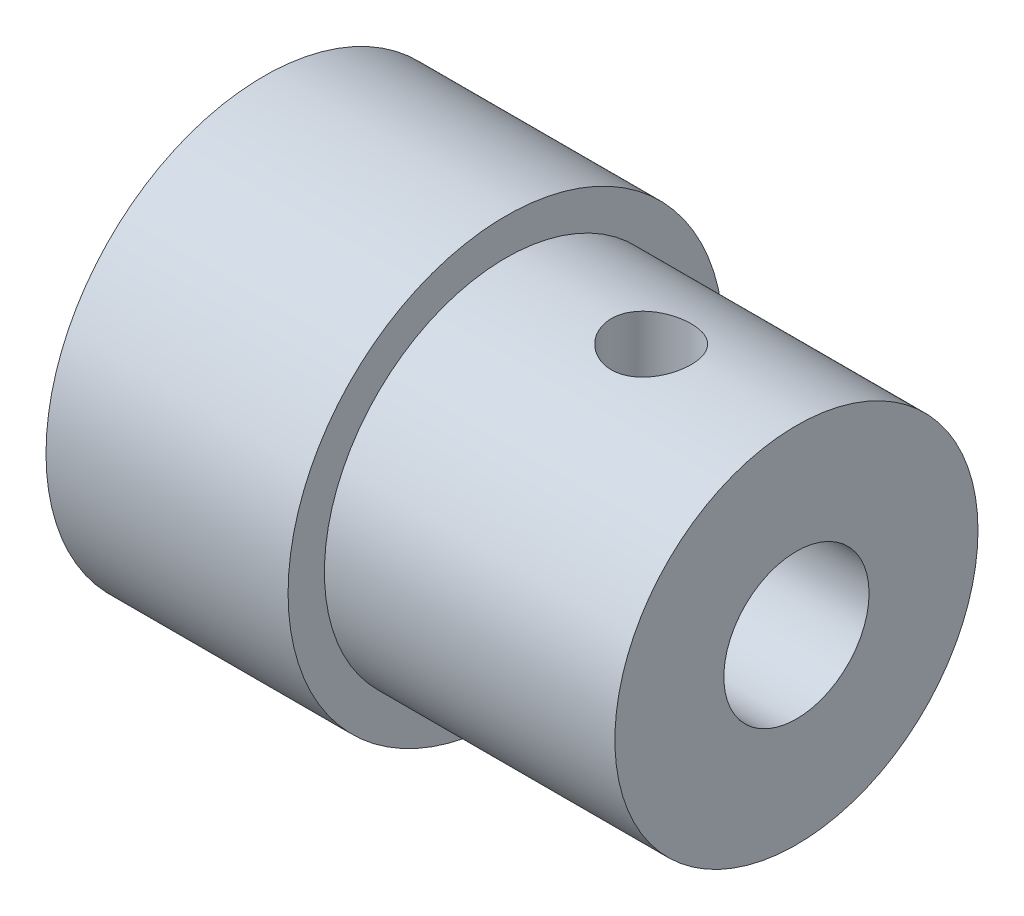
ISO-10303-21;
HEADER;
FILE_DESCRIPTION(('STEP AP214'),'2;1');
FILE_NAME('part.step','',(''),(''),'','','');
FILE_SCHEMA(('AUTOMOTIVE_DESIGN { 1 0 10303 214 1 1 1 1 }'));
ENDSEC;
DATA;
#1=APPLICATION_CONTEXT('core data for automotive mechanical design processes');
#2=APPLICATION_PROTOCOL_DEFINITION('international standard','automotive_design',2000,#1);
#3=PRODUCT_CONTEXT('',#1,'mechanical');
#4=PRODUCT('Part','Part','',(#3));
#5=PRODUCT_RELATED_PRODUCT_CATEGORY('part','',(#4));
#6=PRODUCT_DEFINITION_FORMATION('','',#4);
#7=PRODUCT_DEFINITION_CONTEXT('part definition',#1,'design');
#8=PRODUCT_DEFINITION('design','',#6,#7);
#9=PRODUCT_DEFINITION_SHAPE('','',#8);
#10=(LENGTH_UNIT() NAMED_UNIT(*) SI_UNIT(.MILLI.,.METRE.));
#11=(NAMED_UNIT(*) PLANE_ANGLE_UNIT() SI_UNIT($,.RADIAN.));
#12=(NAMED_UNIT(*) SI_UNIT($,.STERADIAN.) SOLID_ANGLE_UNIT());
#13=UNCERTAINTY_MEASURE_WITH_UNIT(LENGTH_MEASURE(1.E-05),#10,'distance_accuracy_value','');
#14=(GEOMETRIC_REPRESENTATION_CONTEXT(3) GLOBAL_UNCERTAINTY_ASSIGNED_CONTEXT((#13)) GLOBAL_UNIT_ASSIGNED_CONTEXT((#10,
#11,#12)) REPRESENTATION_CONTEXT('',''));
#15=CARTESIAN_POINT('',(0.,0.,0.));
#16=DIRECTION('',(0.,0.,1.));
#17=DIRECTION('',(1.,0.,0.));
#18=AXIS2_PLACEMENT_3D('',#15,#16,#17);
#19=CARTESIAN_POINT('',(-1.,0.,0.));
#20=DIRECTION('',(1.,0.,0.));
#21=DIRECTION('',(0.,0.,-1.));
#22=AXIS2_PLACEMENT_3D('',#19,#20,#21);
#23=CYLINDRICAL_SURFACE('',#22,7.5);
#24=CARTESIAN_POINT('',(11.,0.,0.));
#25=DIRECTION('',(1.,0.,0.));
#26=DIRECTION('',(0.,0.,-1.));
#27=AXIS2_PLACEMENT_3D('',#24,#25,#26);
#28=CIRCLE('',#27,7.5);
#29=CARTESIAN_POINT('',(11.,0.,-7.5));
#30=VERTEX_POINT('',#29);
#31=EDGE_CURVE('E60',#30,#30,#28,.T.);
#32=ORIENTED_EDGE('',*,*,#31,.F.);
#33=EDGE_LOOP('',(#32));
#34=FACE_BOUND('',#33,.T.);
#35=CARTESIAN_POINT('',(-1.,0.,0.));
#36=DIRECTION('',(1.,0.,0.));
#37=DIRECTION('',(0.,0.,-1.));
#38=AXIS2_PLACEMENT_3D('',#35,#36,#37);
#39=CIRCLE('',#38,7.5);
#40=CARTESIAN_POINT('',(-1.,0.,-7.5));
#41=VERTEX_POINT('',#40);
#42=EDGE_CURVE('E53',#41,#41,#39,.T.);
#43=ORIENTED_EDGE('',*,*,#42,.T.);
#44=EDGE_LOOP('',(#43));
#45=FACE_BOUND('',#44,.T.);
#46=CARTESIAN_POINT('',(5.,7.31624903895432,-1.65));
#47=CARTESIAN_POINT('',(5.09146973086408,7.31625088755516,-1.64999687238678));
#48=CARTESIAN_POINT('',(5.18297693288285,7.31798309325129,-1.64236802798416));
#49=CARTESIAN_POINT('',(5.36338806456882,7.32471183232318,-1.61208819446858));
#50=CARTESIAN_POINT('',(5.45229007849127,7.32971070790264,-1.58942642656669));
#51=CARTESIAN_POINT('',(5.62485502908709,7.34237985840046,-1.52982964328276));
#52=CARTESIAN_POINT('',(5.70852363456255,7.3500471816098,-1.49291039391801));
#53=CARTESIAN_POINT('',(5.86848154689289,7.36718575613814,-1.40589188591684));
#54=CARTESIAN_POINT('',(5.94477098755221,7.37665697473834,-1.35579286632696));
#55=CARTESIAN_POINT('',(6.08910974076172,7.39651700312721,-1.24292433856889));
#56=CARTESIAN_POINT('',(6.15701458900787,7.40691766647597,-1.17997213988133));
#57=CARTESIAN_POINT('',(6.28139107633494,7.42736095401494,-1.04357858167988));
#58=CARTESIAN_POINT('',(6.33786182024078,7.43740355012141,-0.970136401673252));
#59=CARTESIAN_POINT('',(6.43833929650792,7.45612834127545,-0.813878252361362));
#60=CARTESIAN_POINT('',(6.48220696771727,7.46479491885843,-0.730970831126892));
#61=CARTESIAN_POINT('',(6.55533320427458,7.47965723905511,-0.558738323735974));
#62=CARTESIAN_POINT('',(6.5845934284299,7.48585326220645,-0.469413967598767));
#63=CARTESIAN_POINT('',(6.6272194994386,7.49499258405706,-0.288385428255497));
#64=CARTESIAN_POINT('',(6.64082987669094,7.49798587273975,-0.196741390048806));
#65=CARTESIAN_POINT('',(6.65253456626563,7.50055570151691,-0.0124251616130076));
#66=CARTESIAN_POINT('',(6.65063067352012,7.50013263686835,0.0802469084385027));
#67=CARTESIAN_POINT('',(6.63154274970476,7.495955593825,0.262302467715072));
#68=CARTESIAN_POINT('',(6.61462230565467,7.49225907708335,0.35171510575584));
#69=CARTESIAN_POINT('',(6.56640176183781,7.48201600117218,0.526399853776886));
#70=CARTESIAN_POINT('',(6.53510100693256,7.47546931215517,0.611671774918589));
#71=CARTESIAN_POINT('',(6.45877597185231,7.4601692539791,0.77638481497967));
#72=CARTESIAN_POINT('',(6.41365201347084,7.4513999396354,0.855778203030067));
#73=CARTESIAN_POINT('',(6.31103585107844,7.43261578068531,1.00596185440213));
#74=CARTESIAN_POINT('',(6.25354194381027,7.42260076463452,1.07675093086628));
#75=CARTESIAN_POINT('',(6.1263837195204,7.4021773054668,1.20928438119749));
#76=CARTESIAN_POINT('',(6.05648871816167,7.39176501831048,1.27080703067333));
#77=CARTESIAN_POINT('',(5.90726574312354,7.37191784161863,1.38129938042404));
#78=CARTESIAN_POINT('',(5.82793750776478,7.36248297921061,1.43026873234956));
#79=CARTESIAN_POINT('',(5.66173851513502,7.34564860357408,1.51436459204098));
#80=CARTESIAN_POINT('',(5.57484565931797,7.33825533607679,1.54944876044604));
#81=CARTESIAN_POINT('',(5.39619629545267,7.32642749366313,1.60445002092193));
#82=CARTESIAN_POINT('',(5.3044405714401,7.32199244335324,1.62436955006424));
#83=CARTESIAN_POINT('',(5.12069723278598,7.31668025811921,1.64813125819888));
#84=CARTESIAN_POINT('',(5.02875341120336,7.31573164606249,1.65229647649247));
#85=CARTESIAN_POINT('',(4.84548511979447,7.31730686199934,1.64530629720023));
#86=CARTESIAN_POINT('',(4.75416060732768,7.31983044843577,1.63415196537922));
#87=CARTESIAN_POINT('',(4.5758509558748,7.32799818106292,1.59711971164379));
#88=CARTESIAN_POINT('',(4.48882689194341,7.33360451240971,1.57142010132685));
#89=CARTESIAN_POINT('',(4.32032002019244,7.34727186080226,1.50622005364931));
#90=CARTESIAN_POINT('',(4.23883774876201,7.35533311504714,1.4667182826445));
#91=CARTESIAN_POINT('',(4.08233060588287,7.37315879650389,1.37432488547164));
#92=CARTESIAN_POINT('',(4.00742593290676,7.38294777227599,1.32123448604819));
#93=CARTESIAN_POINT('',(3.86747028808809,7.4030613604032,1.20343062618999));
#94=CARTESIAN_POINT('',(3.80242055682212,7.41338603997542,1.13871570465476));
#95=CARTESIAN_POINT('',(3.68276535480176,7.43364357465481,0.998037209735758));
#96=CARTESIAN_POINT('',(3.6283802494884,7.44356535241183,0.921884336180659));
#97=CARTESIAN_POINT('',(3.53317489882865,7.46169442992805,0.76133603682461));
#98=CARTESIAN_POINT('',(3.49235401607305,7.46990181024338,0.676940998580233));
#99=CARTESIAN_POINT('',(3.42574171059228,7.48363068143194,0.502832892211444));
#100=CARTESIAN_POINT('',(3.3998544564071,7.48916925974756,0.413157897094228));
#101=CARTESIAN_POINT('',(3.36354535667227,7.49701039926598,0.230596117157432));
#102=CARTESIAN_POINT('',(3.35312123521036,7.49931343668317,0.137709807049035));
#103=CARTESIAN_POINT('',(3.34813763024745,7.5004096608408,-0.0465467976168781));
#104=CARTESIAN_POINT('',(3.35324928652385,7.49927560514944,-0.137907919239362));
#105=CARTESIAN_POINT('',(3.37845586812367,7.49378116111434,-0.31843493854921));
#106=CARTESIAN_POINT('',(3.39855051797475,7.48942083208781,-0.407600876565351));
#107=CARTESIAN_POINT('',(3.45299430459218,7.47796938667334,-0.580948603319165));
#108=CARTESIAN_POINT('',(3.48729629955119,7.47088730695872,-0.665145833031291));
#109=CARTESIAN_POINT('',(3.56913529507116,7.45474818907578,-0.826633320628087));
#110=CARTESIAN_POINT('',(3.61667359644966,7.44569095681539,-0.903922898666404));
#111=CARTESIAN_POINT('',(3.72470542656565,7.42637227436533,-1.05100357132853));
#112=CARTESIAN_POINT('',(3.7854299159513,7.41609106168948,-1.12062244296407));
#113=CARTESIAN_POINT('',(3.91764517036168,7.39558892619985,-1.24879435055272));
#114=CARTESIAN_POINT('',(3.98913853101667,7.38536801854032,-1.30734471095974));
#115=CARTESIAN_POINT('',(4.1420282321614,7.36598909951959,-1.41248320884192));
#116=CARTESIAN_POINT('',(4.2235457294591,7.35684738344025,-1.4588983418391));
#117=CARTESIAN_POINT('',(4.39340812301068,7.34086729136659,-1.53729647396116));
#118=CARTESIAN_POINT('',(4.48174719748978,7.33402697741117,-1.56929162359241));
#119=CARTESIAN_POINT('',(4.64180640143421,7.3246814998452,-1.61226511938889));
#120=CARTESIAN_POINT('',(4.71266180531771,7.32154041784381,-1.62638842605612));
#121=CARTESIAN_POINT('',(4.85567040573682,7.31732350955714,-1.64525686645986));
#122=CARTESIAN_POINT('',(4.92782353736554,7.31624758026992,-1.65000246792088));
#123=CARTESIAN_POINT('',(5.,7.31624903895432,-1.65));
#124=B_SPLINE_CURVE_WITH_KNOTS('',3,(#46,#47,#48,#49,#50,#51,#52,#53,#54,#55,#56,#57,#58,#59,
#60,#61,#62,#63,#64,#65,#66,#67,#68,#69,#70,#71,#72,#73,#74,#75,#76,#77,#78,#79,#80,#81,#82,#83,
#84,#85,#86,#87,#88,#89,#90,#91,#92,#93,#94,#95,#96,#97,#98,#99,#100,#101,#102,#103,#104,#105,
#106,#107,#108,#109,#110,#111,#112,#113,#114,#115,#116,#117,#118,#119,#120,#121,#122,#123),
.UNSPECIFIED.,.T.,.F.,(4,2,2,2,2,2,2,2,2,2,2,2,2,2,2,2,2,2,2,2,2,2,2,2,2,2,2,2,2,2,2,2,2,2,2,2,
2,2,4),(0.,0.274144651661673,0.548486081142453,0.822525006744837,1.09655896234066,
1.37479941240961,1.65306163748477,1.93428561187474,2.21547764347729,2.49221362033069,
2.76891758051511,3.04085852905802,3.31281186792031,3.58677434219926,3.86077456340393,
4.14054172785272,4.42031665489643,4.70093823069211,4.98151469896662,5.25630579423046,
5.53107777353831,5.8025520804998,6.07405262612899,6.34977751987123,6.62553709409573,
6.90650280685807,7.18745531462717,7.46658425375132,7.74567210572695,8.01889368789618,
8.29211024682833,8.5644274097904,8.83677134457515,9.11433803885879,9.39197174265346,
9.67337079196287,9.95453228463009,10.1708637200099,10.3871843653226),.UNSPECIFIED.);
#125=CARTESIAN_POINT('',(5.,7.31624903895432,-1.65));
#126=VERTEX_POINT('',#125);
#127=EDGE_CURVE('E75',#126,#126,#124,.T.);
#128=ORIENTED_EDGE('',*,*,#127,.T.);
#129=EDGE_LOOP('',(#128));
#130=FACE_BOUND('',#129,.T.);
#131=ADVANCED_FACE('F40',(#34,#45,#130),#23,.T.);
#132=CARTESIAN_POINT('',(-5.,0.,0.));
#133=DIRECTION('',(1.,0.,0.));
#134=DIRECTION('',(0.,0.,-1.));
#135=AXIS2_PLACEMENT_3D('',#132,#133,#134);
#136=CYLINDRICAL_SURFACE('',#135,3.);
#137=CARTESIAN_POINT('',(-5.,0.,0.));
#138=DIRECTION('',(1.,0.,0.));
#139=DIRECTION('',(0.,0.,-1.));
#140=AXIS2_PLACEMENT_3D('',#137,#138,#139);
#141=CIRCLE('',#140,3.);
#142=CARTESIAN_POINT('',(-5.,0.,-3.));
#143=VERTEX_POINT('',#142);
#144=EDGE_CURVE('E58',#143,#143,#141,.T.);
#145=ORIENTED_EDGE('',*,*,#144,.F.);
#146=EDGE_LOOP('',(#145));
#147=FACE_BOUND('',#146,.T.);
#148=CARTESIAN_POINT('',(11.,0.,0.));
#149=DIRECTION('',(1.,0.,0.));
#150=DIRECTION('',(0.,0.,-1.));
#151=AXIS2_PLACEMENT_3D('',#148,#149,#150);
#152=CIRCLE('',#151,3.);
#153=CARTESIAN_POINT('',(11.,0.,-3.));
#154=VERTEX_POINT('',#153);
#155=EDGE_CURVE('E65',#154,#154,#152,.T.);
#156=ORIENTED_EDGE('',*,*,#155,.T.);
#157=EDGE_LOOP('',(#156));
#158=FACE_BOUND('',#157,.T.);
#159=CARTESIAN_POINT('',(5.,2.50549396327351,-1.65));
#160=CARTESIAN_POINT('',(5.08456224412422,2.50550290729145,-1.64999358115515));
#161=CARTESIAN_POINT('',(5.16919841964375,2.50984278304633,-1.64345412095508));
#162=CARTESIAN_POINT('',(5.3357580106561,2.52652305472093,-1.61768357796129));
#163=CARTESIAN_POINT('',(5.41767660773709,2.5388769381334,-1.5984310983052));
#164=CARTESIAN_POINT('',(5.57605815834165,2.56969514424061,-1.54839133504121));
#165=CARTESIAN_POINT('',(5.65255166363978,2.58812128253767,-1.51767597794516));
#166=CARTESIAN_POINT('',(5.79927074932326,2.62894573960704,-1.44580368027316));
#167=CARTESIAN_POINT('',(5.86949501937877,2.65134488586739,-1.40464456372702));
#168=CARTESIAN_POINT('',(6.00949302048609,2.70034227169485,-1.30818987552103));
#169=CARTESIAN_POINT('',(6.07850385692035,2.72713610292843,-1.25188597568528));
#170=CARTESIAN_POINT('',(6.20671542475616,2.78033402122329,-1.12882249865068));
#171=CARTESIAN_POINT('',(6.26591027944562,2.8067378662503,-1.06205670422282));
#172=CARTESIAN_POINT('',(6.37781278752496,2.85888255333956,-0.912984038802344));
#173=CARTESIAN_POINT('',(6.42952708912563,2.88437182872328,-0.829835009326254));
#174=CARTESIAN_POINT('',(6.51787790618033,2.92916377464779,-0.654349556397894));
#175=CARTESIAN_POINT('',(6.55452591089576,2.94847115688416,-0.562020200659685));
#176=CARTESIAN_POINT('',(6.60849398479963,2.9772938233039,-0.378922854343172));
#177=CARTESIAN_POINT('',(6.62716814327195,2.98749000620555,-0.288663762188309));
#178=CARTESIAN_POINT('',(6.64917477835194,2.99953120217528,-0.105768848971925));
#179=CARTESIAN_POINT('',(6.65251888599857,3.00138254652496,-0.0131348834272884));
#180=CARTESIAN_POINT('',(6.6441598762631,2.99679126383707,0.161456942743377));
#181=CARTESIAN_POINT('',(6.63399569896197,2.99119680588262,0.243517036042415));
#182=CARTESIAN_POINT('',(6.60174386066673,2.97370139090637,0.404548934713678));
#183=CARTESIAN_POINT('',(6.57965528402605,2.96179994958743,0.483520502425806));
#184=CARTESIAN_POINT('',(6.52418240454989,2.93258792133285,0.637279429786406));
#185=CARTESIAN_POINT('',(6.49067904874512,2.91522047737549,0.712012587065491));
#186=CARTESIAN_POINT('',(6.41356855385775,2.87655421939416,0.854941741305337));
#187=CARTESIAN_POINT('',(6.36995818281495,2.85525414826244,0.923135637298119));
#188=CARTESIAN_POINT('',(6.26851524995847,2.80791814382438,1.05891717191853));
#189=CARTESIAN_POINT('',(6.2096560691274,2.78161920172535,1.12564617195586));
#190=CARTESIAN_POINT('',(6.08207579455025,2.7285563799978,1.24879377983835));
#191=CARTESIAN_POINT('',(6.01334455874152,2.70179204741387,1.30520164705459));
#192=CARTESIAN_POINT('',(5.86070204577057,2.64816260741379,1.41104757147093));
#193=CARTESIAN_POINT('',(5.77598782502349,2.62149493557528,1.45943898084593));
#194=CARTESIAN_POINT('',(5.5979123412443,2.57442669454811,1.54096072440202));
#195=CARTESIAN_POINT('',(5.50456122610489,2.55401888906632,1.57410870202277));
#196=CARTESIAN_POINT('',(5.31961756608595,2.52428868885372,1.621324807476));
#197=CARTESIAN_POINT('',(5.22849229281884,2.51420388175754,1.63671808149072));
#198=CARTESIAN_POINT('',(5.04443856739545,2.50421132283931,1.65197600548299));
#199=CARTESIAN_POINT('',(4.9515122989948,2.50429193328554,1.65185841284551));
#200=CARTESIAN_POINT('',(4.78101930322447,2.51381291635781,1.63731066997579));
#201=CARTESIAN_POINT('',(4.70318323721181,2.52189118280773,1.6249632757909));
#202=CARTESIAN_POINT('',(4.5509051572916,2.54430898316227,1.58963092545288));
#203=CARTESIAN_POINT('',(4.47646464880278,2.55865126498177,1.56664130047228));
#204=CARTESIAN_POINT('',(4.32943158565931,2.59264701052962,1.50974087534156));
#205=CARTESIAN_POINT('',(4.25704917930496,2.61249886195853,1.47541058671725));
#206=CARTESIAN_POINT('',(4.11863846701702,2.65517525628181,1.39715088074391));
#207=CARTESIAN_POINT('',(4.05261332801741,2.67800126759515,1.35321671440463));
#208=CARTESIAN_POINT('',(3.91782401716695,2.72838745980259,1.24890384728535));
#209=CARTESIAN_POINT('',(3.85028334454636,2.75612471210542,1.18702256034847));
#210=CARTESIAN_POINT('',(3.72605536541755,2.81021466477288,1.05259034248067));
#211=CARTESIAN_POINT('',(3.66937442339405,2.83656654669951,0.980033198593373));
#212=CARTESIAN_POINT('',(3.56581643522166,2.88655886174343,0.821591432017619));
#213=CARTESIAN_POINT('',(3.51958019221826,2.90999476284886,0.735218364495385));
#214=CARTESIAN_POINT('',(3.44278569462413,2.94980224898629,0.554269536180263));
#215=CARTESIAN_POINT('',(3.41221113943847,2.96618117604292,0.459702424085392));
#216=CARTESIAN_POINT('',(3.37069388160817,2.98862325067975,0.275417797995456));
#217=CARTESIAN_POINT('',(3.35806903065565,2.99556705432428,0.186187129425337));
#218=CARTESIAN_POINT('',(3.34756810656545,3.00133436858647,0.00661676308886447));
#219=CARTESIAN_POINT('',(3.34968426418038,3.00016215675142,-0.0837223254250938));
#220=CARTESIAN_POINT('',(3.36766992846187,2.99031042427524,-0.254358366297032));
#221=CARTESIAN_POINT('',(3.38229366679433,2.98231104671828,-0.334831363047834));
#222=CARTESIAN_POINT('',(3.42296482199048,2.96044701025379,-0.491985833876879));
#223=CARTESIAN_POINT('',(3.44901360195534,2.94658165149358,-0.568666854326148));
#224=CARTESIAN_POINT('',(3.51261263203962,2.91359875185443,-0.719080279481094));
#225=CARTESIAN_POINT('',(3.55052559404503,2.89431787940932,-0.792622296205403));
#226=CARTESIAN_POINT('',(3.63632550148768,2.85231650614788,-0.932542405269455));
#227=CARTESIAN_POINT('',(3.68421648059952,2.82959461529654,-0.99891758384472));
#228=CARTESIAN_POINT('',(3.79492600165038,2.77974517125015,-1.13072210629174));
#229=CARTESIAN_POINT('',(3.85882783372567,2.75241145940814,-1.19516495605846));
#230=CARTESIAN_POINT('',(3.99650713755192,2.69823878537054,-1.31290440702821));
#231=CARTESIAN_POINT('',(4.07029646527335,2.67140046184162,-1.36618742691371));
#232=CARTESIAN_POINT('',(4.23172400005144,2.61945108088931,-1.46345962344263));
#233=CARTESIAN_POINT('',(4.31995639859265,2.59457299089604,-1.50659692748028));
#234=CARTESIAN_POINT('',(4.50417880040868,2.55252885584285,-1.57680093269354));
#235=CARTESIAN_POINT('',(4.60014295282817,2.53533827536757,-1.60391885150154));
#236=CARTESIAN_POINT('',(4.74780878305847,2.5176692541321,-1.6313948659609));
#237=CARTESIAN_POINT('',(4.79787476415997,2.51313062613142,-1.6383544404993));
#238=CARTESIAN_POINT('',(4.89861831240748,2.50704033236465,-1.64765888075615));
#239=CARTESIAN_POINT('',(4.94929586596914,2.50548860037558,-1.65000384878586));
#240=CARTESIAN_POINT('',(5.,2.50549396327351,-1.65));
#241=B_SPLINE_CURVE_WITH_KNOTS('',3,(#159,#160,#161,#162,#163,#164,#165,#166,#167,#168,#169,
#170,#171,#172,#173,#174,#175,#176,#177,#178,#179,#180,#181,#182,#183,#184,#185,#186,#187,#188,
#189,#190,#191,#192,#193,#194,#195,#196,#197,#198,#199,#200,#201,#202,#203,#204,#205,#206,#207,
#208,#209,#210,#211,#212,#213,#214,#215,#216,#217,#218,#219,#220,#221,#222,#223,#224,#225,#226,
#227,#228,#229,#230,#231,#232,#233,#234,#235,#236,#237,#238,#239,#240),.UNSPECIFIED.,.T.,.F.,(4,
2,2,2,2,2,2,2,2,2,2,2,2,2,2,2,2,2,2,2,2,2,2,2,2,2,2,2,2,2,2,2,2,2,2,2,2,2,2,2,4),(0.,
0.253471464978916,0.507370630471963,0.759702723718415,1.01208743389991,1.28998079678324,
1.56803993512379,1.86997289364919,2.17167517502776,2.44828286528195,2.72468065617498,
2.9721366309398,3.21961160997027,3.46975098230538,3.71997045333205,3.99717687977863,
4.27467015892956,4.57652503396566,4.8780296436106,5.15517475627462,5.43200258623579,
5.66859462056208,5.90529054812099,6.15196333618108,6.39875837770523,6.68465599353131,
6.97072065421035,7.27125286686233,7.57147164850534,7.84111747203333,8.1106211895083,
8.35604451303954,8.60149712555499,8.85533990697406,9.10928550569675,9.39243346006448,
9.67592402360687,9.97823556729933,10.2795752459721,10.4315619419379,10.5835452681421),.UNSPECIFIED.);
#242=CARTESIAN_POINT('',(5.,2.50549396327351,-1.65));
#243=VERTEX_POINT('',#242);
#244=EDGE_CURVE('E41',#243,#243,#241,.T.);
#245=ORIENTED_EDGE('',*,*,#244,.F.);
#246=EDGE_LOOP('',(#245));
#247=FACE_BOUND('',#246,.T.);
#248=ADVANCED_FACE('F96',(#147,#158,#247),#136,.F.);
#249=CARTESIAN_POINT('',(11.,0.,0.));
#250=DIRECTION('',(-1.,0.,0.));
#251=DIRECTION('',(0.,0.,1.));
#252=AXIS2_PLACEMENT_3D('',#249,#250,#251);
#253=CYLINDRICAL_SURFACE('',#252,9.);
#254=CARTESIAN_POINT('',(-11.,0.,0.));
#255=DIRECTION('',(1.,0.,0.));
#256=DIRECTION('',(0.,0.,-1.));
#257=AXIS2_PLACEMENT_3D('',#254,#255,#256);
#258=CIRCLE('',#257,9.);
#259=CARTESIAN_POINT('',(-11.,0.,-9.));
#260=VERTEX_POINT('',#259);
#261=EDGE_CURVE('E10',#260,#260,#258,.T.);
#262=ORIENTED_EDGE('',*,*,#261,.T.);
#263=EDGE_LOOP('',(#262));
#264=FACE_BOUND('',#263,.T.);
#265=CARTESIAN_POINT('',(-1.,0.,0.));
#266=DIRECTION('',(1.,0.,0.));
#267=DIRECTION('',(0.,0.,-1.));
#268=AXIS2_PLACEMENT_3D('',#265,#266,#267);
#269=CIRCLE('',#268,9.);
#270=CARTESIAN_POINT('',(-1.,0.,-9.));
#271=VERTEX_POINT('',#270);
#272=EDGE_CURVE('E49',#271,#271,#269,.T.);
#273=ORIENTED_EDGE('',*,*,#272,.F.);
#274=EDGE_LOOP('',(#273));
#275=FACE_BOUND('',#274,.T.);
#276=ADVANCED_FACE('F39',(#264,#275),#253,.T.);
#277=CARTESIAN_POINT('',(-11.,0.,0.));
#278=DIRECTION('',(1.,0.,0.));
#279=DIRECTION('',(0.,0.,-1.));
#280=AXIS2_PLACEMENT_3D('',#277,#278,#279);
#281=PLANE('',#280);
#282=CARTESIAN_POINT('',(-11.,0.,0.));
#283=DIRECTION('',(-1.,0.,0.));
#284=DIRECTION('',(0.,0.,1.));
#285=AXIS2_PLACEMENT_3D('',#282,#283,#284);
#286=CIRCLE('',#285,2.1);
#287=CARTESIAN_POINT('',(-11.,0.,2.1));
#288=VERTEX_POINT('',#287);
#289=EDGE_CURVE('E68',#288,#288,#286,.T.);
#290=ORIENTED_EDGE('',*,*,#289,.F.);
#291=EDGE_LOOP('',(#290));
#292=FACE_BOUND('',#291,.T.);
#293=ORIENTED_EDGE('',*,*,#261,.F.);
#294=EDGE_LOOP('',(#293));
#295=FACE_BOUND('',#294,.T.);
#296=ADVANCED_FACE('F102',(#292,#295),#281,.F.);
#297=CARTESIAN_POINT('',(-1.,0.,0.));
#298=DIRECTION('',(1.,0.,0.));
#299=DIRECTION('',(0.,0.,-1.));
#300=AXIS2_PLACEMENT_3D('',#297,#298,#299);
#301=PLANE('',#300);
#302=ORIENTED_EDGE('',*,*,#42,.F.);
#303=EDGE_LOOP('',(#302));
#304=FACE_BOUND('',#303,.T.);
#305=ORIENTED_EDGE('',*,*,#272,.T.);
#306=EDGE_LOOP('',(#305));
#307=FACE_BOUND('',#306,.T.);
#308=ADVANCED_FACE('F119',(#304,#307),#301,.T.);
#309=CARTESIAN_POINT('',(11.,0.,0.));
#310=DIRECTION('',(1.,0.,0.));
#311=DIRECTION('',(0.,0.,-1.));
#312=AXIS2_PLACEMENT_3D('',#309,#310,#311);
#313=PLANE('',#312);
#314=ORIENTED_EDGE('',*,*,#155,.F.);
#315=EDGE_LOOP('',(#314));
#316=FACE_BOUND('',#315,.T.);
#317=ORIENTED_EDGE('',*,*,#31,.T.);
#318=EDGE_LOOP('',(#317));
#319=FACE_BOUND('',#318,.T.);
#320=ADVANCED_FACE('F94',(#316,#319),#313,.T.);
#321=CARTESIAN_POINT('',(-5.,0.,0.));
#322=DIRECTION('',(1.,0.,0.));
#323=DIRECTION('',(0.,0.,-1.));
#324=AXIS2_PLACEMENT_3D('',#321,#322,#323);
#325=PLANE('',#324);
#326=CARTESIAN_POINT('',(-5.,0.,0.));
#327=DIRECTION('',(1.,0.,0.));
#328=DIRECTION('',(0.,0.,-1.));
#329=AXIS2_PLACEMENT_3D('',#326,#327,#328);
#330=CIRCLE('',#329,2.1);
#331=CARTESIAN_POINT('',(-5.,0.,-2.1));
#332=VERTEX_POINT('',#331);
#333=EDGE_CURVE('E70',#332,#332,#330,.F.);
#334=ORIENTED_EDGE('',*,*,#333,.T.);
#335=EDGE_LOOP('',(#334));
#336=FACE_BOUND('',#335,.T.);
#337=ORIENTED_EDGE('',*,*,#144,.T.);
#338=EDGE_LOOP('',(#337));
#339=FACE_BOUND('',#338,.T.);
#340=ADVANCED_FACE('F93',(#336,#339),#325,.T.);
#341=CARTESIAN_POINT('',(11.001,0.,0.));
#342=DIRECTION('',(-1.,0.,0.));
#343=DIRECTION('',(0.,0.,1.));
#344=AXIS2_PLACEMENT_3D('',#341,#342,#343);
#345=CYLINDRICAL_SURFACE('',#344,2.1);
#346=ORIENTED_EDGE('',*,*,#333,.F.);
#347=EDGE_LOOP('',(#346));
#348=FACE_BOUND('',#347,.T.);
#349=ORIENTED_EDGE('',*,*,#289,.T.);
#350=EDGE_LOOP('',(#349));
#351=FACE_BOUND('',#350,.T.);
#352=ADVANCED_FACE('F88',(#348,#351),#345,.F.);
#353=CARTESIAN_POINT('',(5.,9.,0.));
#354=DIRECTION('',(0.,-1.,0.));
#355=DIRECTION('',(0.,0.,-1.));
#356=AXIS2_PLACEMENT_3D('',#353,#354,#355);
#357=CYLINDRICAL_SURFACE('',#356,1.65);
#358=ORIENTED_EDGE('',*,*,#127,.F.);
#359=EDGE_LOOP('',(#358));
#360=FACE_BOUND('',#359,.T.);
#361=ORIENTED_EDGE('',*,*,#244,.T.);
#362=EDGE_LOOP('',(#361));
#363=FACE_BOUND('',#362,.T.);
#364=ADVANCED_FACE('F85',(#360,#363),#357,.F.);
#365=CLOSED_SHELL('',(#131,#248,#276,#296,#308,#320,#340,#352,#364));
#366=MANIFOLD_SOLID_BREP('B2',#365);
#367=ADVANCED_BREP_SHAPE_REPRESENTATION('',(#18,#366),#14);
#368=SHAPE_DEFINITION_REPRESENTATION(#9,#367);
ENDSEC;
END-ISO-10303-21;
